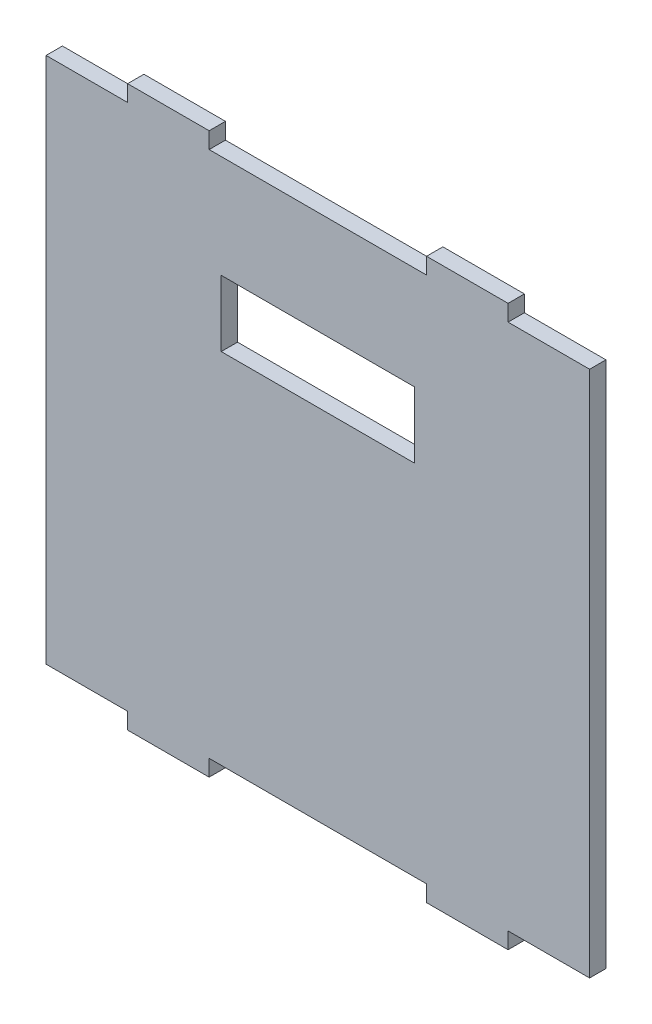
ISO-10303-21;
HEADER;
FILE_DESCRIPTION(('STEP AP214'),'2;1');
FILE_NAME('part.step','',(''),(''),'','','');
FILE_SCHEMA(('AUTOMOTIVE_DESIGN { 1 0 10303 214 1 1 1 1 }'));
ENDSEC;
DATA;
#1=APPLICATION_CONTEXT('core data for automotive mechanical design processes');
#2=APPLICATION_PROTOCOL_DEFINITION('international standard','automotive_design',2000,#1);
#3=PRODUCT_CONTEXT('',#1,'mechanical');
#4=PRODUCT('Part','Part','',(#3));
#5=PRODUCT_RELATED_PRODUCT_CATEGORY('part','',(#4));
#6=PRODUCT_DEFINITION_FORMATION('','',#4);
#7=PRODUCT_DEFINITION_CONTEXT('part definition',#1,'design');
#8=PRODUCT_DEFINITION('design','',#6,#7);
#9=PRODUCT_DEFINITION_SHAPE('','',#8);
#10=(LENGTH_UNIT() NAMED_UNIT(*) SI_UNIT(.MILLI.,.METRE.));
#11=(NAMED_UNIT(*) PLANE_ANGLE_UNIT() SI_UNIT($,.RADIAN.));
#12=(NAMED_UNIT(*) SI_UNIT($,.STERADIAN.) SOLID_ANGLE_UNIT());
#13=UNCERTAINTY_MEASURE_WITH_UNIT(LENGTH_MEASURE(1.E-05),#10,'distance_accuracy_value','');
#14=(GEOMETRIC_REPRESENTATION_CONTEXT(3) GLOBAL_UNCERTAINTY_ASSIGNED_CONTEXT((#13)) GLOBAL_UNIT_ASSIGNED_CONTEXT((#10,
#11,#12)) REPRESENTATION_CONTEXT('',''));
#15=CARTESIAN_POINT('',(0.,0.,0.));
#16=DIRECTION('',(0.,0.,1.));
#17=DIRECTION('',(1.,0.,0.));
#18=AXIS2_PLACEMENT_3D('',#15,#16,#17);
#19=CARTESIAN_POINT('',(70.,-97.,6.));
#20=DIRECTION('',(0.,1.,0.));
#21=DIRECTION('',(0.,0.,1.));
#22=AXIS2_PLACEMENT_3D('',#19,#20,#21);
#23=PLANE('',#22);
#24=DIRECTION('',(1.,0.,0.));
#25=VECTOR('',#24,1.);
#26=CARTESIAN_POINT('',(70.,-97.,0.));
#27=LINE('',#26,#25);
#28=CARTESIAN_POINT('',(70.,-97.,0.));
#29=VERTEX_POINT('',#28);
#30=CARTESIAN_POINT('',(100.,-97.,0.));
#31=VERTEX_POINT('',#30);
#32=EDGE_CURVE('E249',#29,#31,#27,.T.);
#33=ORIENTED_EDGE('',*,*,#32,.T.);
#34=DIRECTION('',(0.,0.,-1.));
#35=VECTOR('',#34,1.);
#36=CARTESIAN_POINT('',(100.,-97.,6.));
#37=LINE('',#36,#35);
#38=CARTESIAN_POINT('',(100.,-97.,6.));
#39=VERTEX_POINT('',#38);
#40=EDGE_CURVE('E11',#39,#31,#37,.T.);
#41=ORIENTED_EDGE('',*,*,#40,.F.);
#42=DIRECTION('',(1.,0.,0.));
#43=VECTOR('',#42,1.);
#44=CARTESIAN_POINT('',(70.,-97.,6.));
#45=LINE('',#44,#43);
#46=CARTESIAN_POINT('',(70.,-97.,6.));
#47=VERTEX_POINT('',#46);
#48=EDGE_CURVE('E255',#47,#39,#45,.T.);
#49=ORIENTED_EDGE('',*,*,#48,.F.);
#50=DIRECTION('',(0.,0.,-1.));
#51=VECTOR('',#50,1.);
#52=CARTESIAN_POINT('',(70.,-97.,6.));
#53=LINE('',#52,#51);
#54=EDGE_CURVE('E317',#47,#29,#53,.T.);
#55=ORIENTED_EDGE('',*,*,#54,.T.);
#56=EDGE_LOOP('',(#33,#41,#49,#55));
#57=FACE_BOUND('',#56,.T.);
#58=ADVANCED_FACE('F45',(#57),#23,.F.);
#59=CARTESIAN_POINT('',(100.,97.,6.));
#60=DIRECTION('',(-1.,0.,0.));
#61=DIRECTION('',(0.,-1.,0.));
#62=AXIS2_PLACEMENT_3D('',#59,#60,#61);
#63=PLANE('',#62);
#64=DIRECTION('',(0.,1.,0.));
#65=VECTOR('',#64,1.);
#66=CARTESIAN_POINT('',(100.,97.,0.));
#67=LINE('',#66,#65);
#68=CARTESIAN_POINT('',(100.,97.,0.));
#69=VERTEX_POINT('',#68);
#70=EDGE_CURVE('E321',#31,#69,#67,.T.);
#71=ORIENTED_EDGE('',*,*,#70,.T.);
#72=DIRECTION('',(0.,0.,-1.));
#73=VECTOR('',#72,1.);
#74=CARTESIAN_POINT('',(100.,97.,6.));
#75=LINE('',#74,#73);
#76=CARTESIAN_POINT('',(100.,97.,6.));
#77=VERTEX_POINT('',#76);
#78=EDGE_CURVE('E53',#77,#69,#75,.T.);
#79=ORIENTED_EDGE('',*,*,#78,.F.);
#80=DIRECTION('',(0.,1.,0.));
#81=VECTOR('',#80,1.);
#82=CARTESIAN_POINT('',(100.,97.,6.));
#83=LINE('',#82,#81);
#84=EDGE_CURVE('E259',#39,#77,#83,.T.);
#85=ORIENTED_EDGE('',*,*,#84,.F.);
#86=ORIENTED_EDGE('',*,*,#40,.T.);
#87=EDGE_LOOP('',(#71,#79,#85,#86));
#88=FACE_BOUND('',#87,.T.);
#89=ADVANCED_FACE('F474',(#88),#63,.F.);
#90=CARTESIAN_POINT('',(100.,97.,6.));
#91=DIRECTION('',(0.,-1.,0.));
#92=DIRECTION('',(0.,0.,-1.));
#93=AXIS2_PLACEMENT_3D('',#90,#91,#92);
#94=PLANE('',#93);
#95=DIRECTION('',(-1.,0.,0.));
#96=VECTOR('',#95,1.);
#97=CARTESIAN_POINT('',(100.,97.,0.));
#98=LINE('',#97,#96);
#99=CARTESIAN_POINT('',(70.,97.,0.));
#100=VERTEX_POINT('',#99);
#101=EDGE_CURVE('E324',#69,#100,#98,.T.);
#102=ORIENTED_EDGE('',*,*,#101,.T.);
#103=DIRECTION('',(0.,0.,-1.));
#104=VECTOR('',#103,1.);
#105=CARTESIAN_POINT('',(70.,97.,6.));
#106=LINE('',#105,#104);
#107=CARTESIAN_POINT('',(70.,97.,6.));
#108=VERTEX_POINT('',#107);
#109=EDGE_CURVE('E444',#108,#100,#106,.T.);
#110=ORIENTED_EDGE('',*,*,#109,.F.);
#111=DIRECTION('',(-1.,0.,0.));
#112=VECTOR('',#111,1.);
#113=CARTESIAN_POINT('',(100.,97.,6.));
#114=LINE('',#113,#112);
#115=EDGE_CURVE('E263',#77,#108,#114,.T.);
#116=ORIENTED_EDGE('',*,*,#115,.F.);
#117=ORIENTED_EDGE('',*,*,#78,.T.);
#118=EDGE_LOOP('',(#102,#110,#116,#117));
#119=FACE_BOUND('',#118,.T.);
#120=ADVANCED_FACE('F453',(#119),#94,.F.);
#121=CARTESIAN_POINT('',(70.,97.,6.));
#122=DIRECTION('',(-1.,0.,0.));
#123=DIRECTION('',(0.,0.,1.));
#124=AXIS2_PLACEMENT_3D('',#121,#122,#123);
#125=PLANE('',#124);
#126=DIRECTION('',(0.,1.,0.));
#127=VECTOR('',#126,1.);
#128=CARTESIAN_POINT('',(70.,97.,0.));
#129=LINE('',#128,#127);
#130=CARTESIAN_POINT('',(70.,103.,0.));
#131=VERTEX_POINT('',#130);
#132=EDGE_CURVE('E327',#100,#131,#129,.T.);
#133=ORIENTED_EDGE('',*,*,#132,.T.);
#134=DIRECTION('',(0.,0.,-1.));
#135=VECTOR('',#134,1.);
#136=CARTESIAN_POINT('',(70.,103.,6.));
#137=LINE('',#136,#135);
#138=CARTESIAN_POINT('',(70.,103.,6.));
#139=VERTEX_POINT('',#138);
#140=EDGE_CURVE('E440',#139,#131,#137,.T.);
#141=ORIENTED_EDGE('',*,*,#140,.F.);
#142=DIRECTION('',(0.,1.,0.));
#143=VECTOR('',#142,1.);
#144=CARTESIAN_POINT('',(70.,97.,6.));
#145=LINE('',#144,#143);
#146=EDGE_CURVE('E266',#108,#139,#145,.T.);
#147=ORIENTED_EDGE('',*,*,#146,.F.);
#148=ORIENTED_EDGE('',*,*,#109,.T.);
#149=EDGE_LOOP('',(#133,#141,#147,#148));
#150=FACE_BOUND('',#149,.T.);
#151=ADVANCED_FACE('F464',(#150),#125,.F.);
#152=CARTESIAN_POINT('',(70.,103.,6.));
#153=DIRECTION('',(0.,-1.,0.));
#154=DIRECTION('',(1.,0.,0.));
#155=AXIS2_PLACEMENT_3D('',#152,#153,#154);
#156=PLANE('',#155);
#157=DIRECTION('',(-1.,0.,0.));
#158=VECTOR('',#157,1.);
#159=CARTESIAN_POINT('',(70.,103.,0.));
#160=LINE('',#159,#158);
#161=CARTESIAN_POINT('',(40.,103.,0.));
#162=VERTEX_POINT('',#161);
#163=EDGE_CURVE('E330',#131,#162,#160,.T.);
#164=ORIENTED_EDGE('',*,*,#163,.T.);
#165=DIRECTION('',(0.,0.,-1.));
#166=VECTOR('',#165,1.);
#167=CARTESIAN_POINT('',(40.,103.,6.));
#168=LINE('',#167,#166);
#169=CARTESIAN_POINT('',(40.,103.,6.));
#170=VERTEX_POINT('',#169);
#171=EDGE_CURVE('E436',#170,#162,#168,.T.);
#172=ORIENTED_EDGE('',*,*,#171,.F.);
#173=DIRECTION('',(-1.,0.,0.));
#174=VECTOR('',#173,1.);
#175=CARTESIAN_POINT('',(70.,103.,6.));
#176=LINE('',#175,#174);
#177=EDGE_CURVE('E269',#139,#170,#176,.T.);
#178=ORIENTED_EDGE('',*,*,#177,.F.);
#179=ORIENTED_EDGE('',*,*,#140,.T.);
#180=EDGE_LOOP('',(#164,#172,#178,#179));
#181=FACE_BOUND('',#180,.T.);
#182=ADVANCED_FACE('F468',(#181),#156,.F.);
#183=CARTESIAN_POINT('',(40.,97.,6.));
#184=DIRECTION('',(1.,0.,0.));
#185=DIRECTION('',(0.,0.,-1.));
#186=AXIS2_PLACEMENT_3D('',#183,#184,#185);
#187=PLANE('',#186);
#188=DIRECTION('',(0.,-1.,0.));
#189=VECTOR('',#188,1.);
#190=CARTESIAN_POINT('',(40.,97.,0.));
#191=LINE('',#190,#189);
#192=CARTESIAN_POINT('',(40.,97.,0.));
#193=VERTEX_POINT('',#192);
#194=EDGE_CURVE('E333',#162,#193,#191,.T.);
#195=ORIENTED_EDGE('',*,*,#194,.T.);
#196=DIRECTION('',(0.,0.,-1.));
#197=VECTOR('',#196,1.);
#198=CARTESIAN_POINT('',(40.,97.,6.));
#199=LINE('',#198,#197);
#200=CARTESIAN_POINT('',(40.,97.,6.));
#201=VERTEX_POINT('',#200);
#202=EDGE_CURVE('E432',#201,#193,#199,.T.);
#203=ORIENTED_EDGE('',*,*,#202,.F.);
#204=DIRECTION('',(0.,-1.,0.));
#205=VECTOR('',#204,1.);
#206=CARTESIAN_POINT('',(40.,97.,6.));
#207=LINE('',#206,#205);
#208=EDGE_CURVE('E272',#170,#201,#207,.T.);
#209=ORIENTED_EDGE('',*,*,#208,.F.);
#210=ORIENTED_EDGE('',*,*,#171,.T.);
#211=EDGE_LOOP('',(#195,#203,#209,#210));
#212=FACE_BOUND('',#211,.T.);
#213=ADVANCED_FACE('F547',(#212),#187,.F.);
#214=CARTESIAN_POINT('',(40.,97.,6.));
#215=DIRECTION('',(0.,-1.,0.));
#216=DIRECTION('',(0.,0.,-1.));
#217=AXIS2_PLACEMENT_3D('',#214,#215,#216);
#218=PLANE('',#217);
#219=DIRECTION('',(-1.,0.,0.));
#220=VECTOR('',#219,1.);
#221=CARTESIAN_POINT('',(40.,97.,0.));
#222=LINE('',#221,#220);
#223=CARTESIAN_POINT('',(-40.,97.,0.));
#224=VERTEX_POINT('',#223);
#225=EDGE_CURVE('E336',#193,#224,#222,.T.);
#226=ORIENTED_EDGE('',*,*,#225,.T.);
#227=DIRECTION('',(0.,0.,-1.));
#228=VECTOR('',#227,1.);
#229=CARTESIAN_POINT('',(-40.,97.,6.));
#230=LINE('',#229,#228);
#231=CARTESIAN_POINT('',(-40.,97.,6.));
#232=VERTEX_POINT('',#231);
#233=EDGE_CURVE('E428',#232,#224,#230,.T.);
#234=ORIENTED_EDGE('',*,*,#233,.F.);
#235=DIRECTION('',(-1.,0.,0.));
#236=VECTOR('',#235,1.);
#237=CARTESIAN_POINT('',(40.,97.,6.));
#238=LINE('',#237,#236);
#239=EDGE_CURVE('E275',#201,#232,#238,.T.);
#240=ORIENTED_EDGE('',*,*,#239,.F.);
#241=ORIENTED_EDGE('',*,*,#202,.T.);
#242=EDGE_LOOP('',(#226,#234,#240,#241));
#243=FACE_BOUND('',#242,.T.);
#244=ADVANCED_FACE('F545',(#243),#218,.F.);
#245=CARTESIAN_POINT('',(-40.,97.,6.));
#246=DIRECTION('',(-1.,0.,0.));
#247=DIRECTION('',(0.,0.,1.));
#248=AXIS2_PLACEMENT_3D('',#245,#246,#247);
#249=PLANE('',#248);
#250=DIRECTION('',(0.,1.,0.));
#251=VECTOR('',#250,1.);
#252=CARTESIAN_POINT('',(-40.,97.,0.));
#253=LINE('',#252,#251);
#254=CARTESIAN_POINT('',(-40.,103.,0.));
#255=VERTEX_POINT('',#254);
#256=EDGE_CURVE('E339',#224,#255,#253,.T.);
#257=ORIENTED_EDGE('',*,*,#256,.T.);
#258=DIRECTION('',(0.,0.,-1.));
#259=VECTOR('',#258,1.);
#260=CARTESIAN_POINT('',(-40.,103.,6.));
#261=LINE('',#260,#259);
#262=CARTESIAN_POINT('',(-40.,103.,6.));
#263=VERTEX_POINT('',#262);
#264=EDGE_CURVE('E424',#263,#255,#261,.T.);
#265=ORIENTED_EDGE('',*,*,#264,.F.);
#266=DIRECTION('',(0.,1.,0.));
#267=VECTOR('',#266,1.);
#268=CARTESIAN_POINT('',(-40.,97.,6.));
#269=LINE('',#268,#267);
#270=EDGE_CURVE('E278',#232,#263,#269,.T.);
#271=ORIENTED_EDGE('',*,*,#270,.F.);
#272=ORIENTED_EDGE('',*,*,#233,.T.);
#273=EDGE_LOOP('',(#257,#265,#271,#272));
#274=FACE_BOUND('',#273,.T.);
#275=ADVANCED_FACE('F540',(#274),#249,.F.);
#276=CARTESIAN_POINT('',(-40.,103.,6.));
#277=DIRECTION('',(0.,-1.,0.));
#278=DIRECTION('',(1.,0.,0.));
#279=AXIS2_PLACEMENT_3D('',#276,#277,#278);
#280=PLANE('',#279);
#281=DIRECTION('',(-1.,0.,0.));
#282=VECTOR('',#281,1.);
#283=CARTESIAN_POINT('',(-40.,103.,0.));
#284=LINE('',#283,#282);
#285=CARTESIAN_POINT('',(-70.,103.,0.));
#286=VERTEX_POINT('',#285);
#287=EDGE_CURVE('E342',#255,#286,#284,.T.);
#288=ORIENTED_EDGE('',*,*,#287,.T.);
#289=DIRECTION('',(0.,0.,-1.));
#290=VECTOR('',#289,1.);
#291=CARTESIAN_POINT('',(-70.,103.,6.));
#292=LINE('',#291,#290);
#293=CARTESIAN_POINT('',(-70.,103.,6.));
#294=VERTEX_POINT('',#293);
#295=EDGE_CURVE('E420',#294,#286,#292,.T.);
#296=ORIENTED_EDGE('',*,*,#295,.F.);
#297=DIRECTION('',(-1.,0.,0.));
#298=VECTOR('',#297,1.);
#299=CARTESIAN_POINT('',(-40.,103.,6.));
#300=LINE('',#299,#298);
#301=EDGE_CURVE('E281',#263,#294,#300,.T.);
#302=ORIENTED_EDGE('',*,*,#301,.F.);
#303=ORIENTED_EDGE('',*,*,#264,.T.);
#304=EDGE_LOOP('',(#288,#296,#302,#303));
#305=FACE_BOUND('',#304,.T.);
#306=ADVANCED_FACE('F535',(#305),#280,.F.);
#307=CARTESIAN_POINT('',(-70.,97.,6.));
#308=DIRECTION('',(1.,0.,0.));
#309=DIRECTION('',(0.,0.,-1.));
#310=AXIS2_PLACEMENT_3D('',#307,#308,#309);
#311=PLANE('',#310);
#312=DIRECTION('',(0.,-1.,0.));
#313=VECTOR('',#312,1.);
#314=CARTESIAN_POINT('',(-70.,97.,0.));
#315=LINE('',#314,#313);
#316=CARTESIAN_POINT('',(-70.,97.,0.));
#317=VERTEX_POINT('',#316);
#318=EDGE_CURVE('E345',#286,#317,#315,.T.);
#319=ORIENTED_EDGE('',*,*,#318,.T.);
#320=DIRECTION('',(0.,0.,-1.));
#321=VECTOR('',#320,1.);
#322=CARTESIAN_POINT('',(-70.,97.,6.));
#323=LINE('',#322,#321);
#324=CARTESIAN_POINT('',(-70.,97.,6.));
#325=VERTEX_POINT('',#324);
#326=EDGE_CURVE('E416',#325,#317,#323,.T.);
#327=ORIENTED_EDGE('',*,*,#326,.F.);
#328=DIRECTION('',(0.,-1.,0.));
#329=VECTOR('',#328,1.);
#330=CARTESIAN_POINT('',(-70.,97.,6.));
#331=LINE('',#330,#329);
#332=EDGE_CURVE('E284',#294,#325,#331,.T.);
#333=ORIENTED_EDGE('',*,*,#332,.F.);
#334=ORIENTED_EDGE('',*,*,#295,.T.);
#335=EDGE_LOOP('',(#319,#327,#333,#334));
#336=FACE_BOUND('',#335,.T.);
#337=ADVANCED_FACE('F531',(#336),#311,.F.);
#338=CARTESIAN_POINT('',(-70.,97.,6.));
#339=DIRECTION('',(0.,-1.,0.));
#340=DIRECTION('',(0.,0.,-1.));
#341=AXIS2_PLACEMENT_3D('',#338,#339,#340);
#342=PLANE('',#341);
#343=DIRECTION('',(-1.,0.,0.));
#344=VECTOR('',#343,1.);
#345=CARTESIAN_POINT('',(-70.,97.,0.));
#346=LINE('',#345,#344);
#347=CARTESIAN_POINT('',(-100.,97.,0.));
#348=VERTEX_POINT('',#347);
#349=EDGE_CURVE('E348',#317,#348,#346,.T.);
#350=ORIENTED_EDGE('',*,*,#349,.T.);
#351=DIRECTION('',(0.,0.,-1.));
#352=VECTOR('',#351,1.);
#353=CARTESIAN_POINT('',(-100.,97.,6.));
#354=LINE('',#353,#352);
#355=CARTESIAN_POINT('',(-100.,97.,6.));
#356=VERTEX_POINT('',#355);
#357=EDGE_CURVE('E412',#356,#348,#354,.T.);
#358=ORIENTED_EDGE('',*,*,#357,.F.);
#359=DIRECTION('',(-1.,0.,0.));
#360=VECTOR('',#359,1.);
#361=CARTESIAN_POINT('',(-70.,97.,6.));
#362=LINE('',#361,#360);
#363=EDGE_CURVE('E287',#325,#356,#362,.T.);
#364=ORIENTED_EDGE('',*,*,#363,.F.);
#365=ORIENTED_EDGE('',*,*,#326,.T.);
#366=EDGE_LOOP('',(#350,#358,#364,#365));
#367=FACE_BOUND('',#366,.T.);
#368=ADVANCED_FACE('F526',(#367),#342,.F.);
#369=CARTESIAN_POINT('',(-100.,97.,6.));
#370=DIRECTION('',(1.,0.,0.));
#371=DIRECTION('',(0.,1.,0.));
#372=AXIS2_PLACEMENT_3D('',#369,#370,#371);
#373=PLANE('',#372);
#374=DIRECTION('',(0.,-1.,0.));
#375=VECTOR('',#374,1.);
#376=CARTESIAN_POINT('',(-100.,97.,0.));
#377=LINE('',#376,#375);
#378=CARTESIAN_POINT('',(-100.,-97.,0.));
#379=VERTEX_POINT('',#378);
#380=EDGE_CURVE('E351',#348,#379,#377,.T.);
#381=ORIENTED_EDGE('',*,*,#380,.T.);
#382=DIRECTION('',(0.,0.,-1.));
#383=VECTOR('',#382,1.);
#384=CARTESIAN_POINT('',(-100.,-97.,6.));
#385=LINE('',#384,#383);
#386=CARTESIAN_POINT('',(-100.,-97.,6.));
#387=VERTEX_POINT('',#386);
#388=EDGE_CURVE('E408',#387,#379,#385,.T.);
#389=ORIENTED_EDGE('',*,*,#388,.F.);
#390=DIRECTION('',(0.,-1.,0.));
#391=VECTOR('',#390,1.);
#392=CARTESIAN_POINT('',(-100.,97.,6.));
#393=LINE('',#392,#391);
#394=EDGE_CURVE('E290',#356,#387,#393,.T.);
#395=ORIENTED_EDGE('',*,*,#394,.F.);
#396=ORIENTED_EDGE('',*,*,#357,.T.);
#397=EDGE_LOOP('',(#381,#389,#395,#396));
#398=FACE_BOUND('',#397,.T.);
#399=ADVANCED_FACE('F520',(#398),#373,.F.);
#400=CARTESIAN_POINT('',(-70.,-97.,6.));
#401=DIRECTION('',(0.,1.,0.));
#402=DIRECTION('',(-1.,0.,0.));
#403=AXIS2_PLACEMENT_3D('',#400,#401,#402);
#404=PLANE('',#403);
#405=DIRECTION('',(1.,0.,0.));
#406=VECTOR('',#405,1.);
#407=CARTESIAN_POINT('',(-70.,-97.,0.));
#408=LINE('',#407,#406);
#409=CARTESIAN_POINT('',(-70.,-97.,0.));
#410=VERTEX_POINT('',#409);
#411=EDGE_CURVE('E354',#379,#410,#408,.T.);
#412=ORIENTED_EDGE('',*,*,#411,.T.);
#413=DIRECTION('',(0.,0.,-1.));
#414=VECTOR('',#413,1.);
#415=CARTESIAN_POINT('',(-70.,-97.,6.));
#416=LINE('',#415,#414);
#417=CARTESIAN_POINT('',(-70.,-97.,6.));
#418=VERTEX_POINT('',#417);
#419=EDGE_CURVE('E404',#418,#410,#416,.T.);
#420=ORIENTED_EDGE('',*,*,#419,.F.);
#421=DIRECTION('',(1.,0.,0.));
#422=VECTOR('',#421,1.);
#423=CARTESIAN_POINT('',(-70.,-97.,6.));
#424=LINE('',#423,#422);
#425=EDGE_CURVE('E293',#387,#418,#424,.T.);
#426=ORIENTED_EDGE('',*,*,#425,.F.);
#427=ORIENTED_EDGE('',*,*,#388,.T.);
#428=EDGE_LOOP('',(#412,#420,#426,#427));
#429=FACE_BOUND('',#428,.T.);
#430=ADVANCED_FACE('F516',(#429),#404,.F.);
#431=CARTESIAN_POINT('',(-70.,-97.,6.));
#432=DIRECTION('',(1.,0.,0.));
#433=DIRECTION('',(0.,0.,-1.));
#434=AXIS2_PLACEMENT_3D('',#431,#432,#433);
#435=PLANE('',#434);
#436=DIRECTION('',(0.,-1.,0.));
#437=VECTOR('',#436,1.);
#438=CARTESIAN_POINT('',(-70.,-97.,0.));
#439=LINE('',#438,#437);
#440=CARTESIAN_POINT('',(-70.,-103.,0.));
#441=VERTEX_POINT('',#440);
#442=EDGE_CURVE('E357',#410,#441,#439,.T.);
#443=ORIENTED_EDGE('',*,*,#442,.T.);
#444=DIRECTION('',(0.,0.,-1.));
#445=VECTOR('',#444,1.);
#446=CARTESIAN_POINT('',(-70.,-103.,6.));
#447=LINE('',#446,#445);
#448=CARTESIAN_POINT('',(-70.,-103.,6.));
#449=VERTEX_POINT('',#448);
#450=EDGE_CURVE('E400',#449,#441,#447,.T.);
#451=ORIENTED_EDGE('',*,*,#450,.F.);
#452=DIRECTION('',(0.,-1.,0.));
#453=VECTOR('',#452,1.);
#454=CARTESIAN_POINT('',(-70.,-97.,6.));
#455=LINE('',#454,#453);
#456=EDGE_CURVE('E296',#418,#449,#455,.T.);
#457=ORIENTED_EDGE('',*,*,#456,.F.);
#458=ORIENTED_EDGE('',*,*,#419,.T.);
#459=EDGE_LOOP('',(#443,#451,#457,#458));
#460=FACE_BOUND('',#459,.T.);
#461=ADVANCED_FACE('F511',(#460),#435,.F.);
#462=CARTESIAN_POINT('',(-70.,-103.,6.));
#463=DIRECTION('',(0.,1.,0.));
#464=DIRECTION('',(0.,0.,1.));
#465=AXIS2_PLACEMENT_3D('',#462,#463,#464);
#466=PLANE('',#465);
#467=DIRECTION('',(1.,0.,0.));
#468=VECTOR('',#467,1.);
#469=CARTESIAN_POINT('',(-70.,-103.,0.));
#470=LINE('',#469,#468);
#471=CARTESIAN_POINT('',(-40.,-103.,0.));
#472=VERTEX_POINT('',#471);
#473=EDGE_CURVE('E360',#441,#472,#470,.T.);
#474=ORIENTED_EDGE('',*,*,#473,.T.);
#475=DIRECTION('',(0.,0.,-1.));
#476=VECTOR('',#475,1.);
#477=CARTESIAN_POINT('',(-40.,-103.,6.));
#478=LINE('',#477,#476);
#479=CARTESIAN_POINT('',(-40.,-103.,6.));
#480=VERTEX_POINT('',#479);
#481=EDGE_CURVE('E396',#480,#472,#478,.T.);
#482=ORIENTED_EDGE('',*,*,#481,.F.);
#483=DIRECTION('',(1.,0.,0.));
#484=VECTOR('',#483,1.);
#485=CARTESIAN_POINT('',(-70.,-103.,6.));
#486=LINE('',#485,#484);
#487=EDGE_CURVE('E299',#449,#480,#486,.T.);
#488=ORIENTED_EDGE('',*,*,#487,.F.);
#489=ORIENTED_EDGE('',*,*,#450,.T.);
#490=EDGE_LOOP('',(#474,#482,#488,#489));
#491=FACE_BOUND('',#490,.T.);
#492=ADVANCED_FACE('F505',(#491),#466,.F.);
#493=CARTESIAN_POINT('',(-40.,-97.,6.));
#494=DIRECTION('',(-1.,0.,0.));
#495=DIRECTION('',(0.,-1.,0.));
#496=AXIS2_PLACEMENT_3D('',#493,#494,#495);
#497=PLANE('',#496);
#498=DIRECTION('',(0.,1.,0.));
#499=VECTOR('',#498,1.);
#500=CARTESIAN_POINT('',(-40.,-97.,0.));
#501=LINE('',#500,#499);
#502=CARTESIAN_POINT('',(-40.,-97.,0.));
#503=VERTEX_POINT('',#502);
#504=EDGE_CURVE('E363',#472,#503,#501,.T.);
#505=ORIENTED_EDGE('',*,*,#504,.T.);
#506=DIRECTION('',(0.,0.,-1.));
#507=VECTOR('',#506,1.);
#508=CARTESIAN_POINT('',(-40.,-97.,6.));
#509=LINE('',#508,#507);
#510=CARTESIAN_POINT('',(-40.,-97.,6.));
#511=VERTEX_POINT('',#510);
#512=EDGE_CURVE('E392',#511,#503,#509,.T.);
#513=ORIENTED_EDGE('',*,*,#512,.F.);
#514=DIRECTION('',(0.,1.,0.));
#515=VECTOR('',#514,1.);
#516=CARTESIAN_POINT('',(-40.,-97.,6.));
#517=LINE('',#516,#515);
#518=EDGE_CURVE('E302',#480,#511,#517,.T.);
#519=ORIENTED_EDGE('',*,*,#518,.F.);
#520=ORIENTED_EDGE('',*,*,#481,.T.);
#521=EDGE_LOOP('',(#505,#513,#519,#520));
#522=FACE_BOUND('',#521,.T.);
#523=ADVANCED_FACE('F501',(#522),#497,.F.);
#524=CARTESIAN_POINT('',(-40.,-97.,6.));
#525=DIRECTION('',(0.,1.,0.));
#526=DIRECTION('',(0.,0.,1.));
#527=AXIS2_PLACEMENT_3D('',#524,#525,#526);
#528=PLANE('',#527);
#529=DIRECTION('',(1.,0.,0.));
#530=VECTOR('',#529,1.);
#531=CARTESIAN_POINT('',(-40.,-97.,0.));
#532=LINE('',#531,#530);
#533=CARTESIAN_POINT('',(40.,-97.,0.));
#534=VERTEX_POINT('',#533);
#535=EDGE_CURVE('E366',#503,#534,#532,.T.);
#536=ORIENTED_EDGE('',*,*,#535,.T.);
#537=DIRECTION('',(0.,0.,-1.));
#538=VECTOR('',#537,1.);
#539=CARTESIAN_POINT('',(40.,-97.,6.));
#540=LINE('',#539,#538);
#541=CARTESIAN_POINT('',(40.,-97.,6.));
#542=VERTEX_POINT('',#541);
#543=EDGE_CURVE('E388',#542,#534,#540,.T.);
#544=ORIENTED_EDGE('',*,*,#543,.F.);
#545=DIRECTION('',(1.,0.,0.));
#546=VECTOR('',#545,1.);
#547=CARTESIAN_POINT('',(-40.,-97.,6.));
#548=LINE('',#547,#546);
#549=EDGE_CURVE('E305',#511,#542,#548,.T.);
#550=ORIENTED_EDGE('',*,*,#549,.F.);
#551=ORIENTED_EDGE('',*,*,#512,.T.);
#552=EDGE_LOOP('',(#536,#544,#550,#551));
#553=FACE_BOUND('',#552,.T.);
#554=ADVANCED_FACE('F496',(#553),#528,.F.);
#555=CARTESIAN_POINT('',(40.,-97.,6.));
#556=DIRECTION('',(1.,0.,0.));
#557=DIRECTION('',(0.,0.,-1.));
#558=AXIS2_PLACEMENT_3D('',#555,#556,#557);
#559=PLANE('',#558);
#560=DIRECTION('',(0.,-1.,0.));
#561=VECTOR('',#560,1.);
#562=CARTESIAN_POINT('',(40.,-97.,0.));
#563=LINE('',#562,#561);
#564=CARTESIAN_POINT('',(40.,-103.,0.));
#565=VERTEX_POINT('',#564);
#566=EDGE_CURVE('E369',#534,#565,#563,.T.);
#567=ORIENTED_EDGE('',*,*,#566,.T.);
#568=DIRECTION('',(0.,0.,-1.));
#569=VECTOR('',#568,1.);
#570=CARTESIAN_POINT('',(40.,-103.,6.));
#571=LINE('',#570,#569);
#572=CARTESIAN_POINT('',(40.,-103.,6.));
#573=VERTEX_POINT('',#572);
#574=EDGE_CURVE('E384',#573,#565,#571,.T.);
#575=ORIENTED_EDGE('',*,*,#574,.F.);
#576=DIRECTION('',(0.,-1.,0.));
#577=VECTOR('',#576,1.);
#578=CARTESIAN_POINT('',(40.,-97.,6.));
#579=LINE('',#578,#577);
#580=EDGE_CURVE('E308',#542,#573,#579,.T.);
#581=ORIENTED_EDGE('',*,*,#580,.F.);
#582=ORIENTED_EDGE('',*,*,#543,.T.);
#583=EDGE_LOOP('',(#567,#575,#581,#582));
#584=FACE_BOUND('',#583,.T.);
#585=ADVANCED_FACE('F490',(#584),#559,.F.);
#586=CARTESIAN_POINT('',(40.,-103.,6.));
#587=DIRECTION('',(0.,1.,0.));
#588=DIRECTION('',(-1.,0.,0.));
#589=AXIS2_PLACEMENT_3D('',#586,#587,#588);
#590=PLANE('',#589);
#591=DIRECTION('',(1.,0.,0.));
#592=VECTOR('',#591,1.);
#593=CARTESIAN_POINT('',(40.,-103.,0.));
#594=LINE('',#593,#592);
#595=CARTESIAN_POINT('',(70.,-103.,0.));
#596=VERTEX_POINT('',#595);
#597=EDGE_CURVE('E372',#565,#596,#594,.T.);
#598=ORIENTED_EDGE('',*,*,#597,.T.);
#599=DIRECTION('',(0.,0.,-1.));
#600=VECTOR('',#599,1.);
#601=CARTESIAN_POINT('',(70.,-103.,6.));
#602=LINE('',#601,#600);
#603=CARTESIAN_POINT('',(70.,-103.,6.));
#604=VERTEX_POINT('',#603);
#605=EDGE_CURVE('E380',#604,#596,#602,.T.);
#606=ORIENTED_EDGE('',*,*,#605,.F.);
#607=DIRECTION('',(1.,0.,0.));
#608=VECTOR('',#607,1.);
#609=CARTESIAN_POINT('',(40.,-103.,6.));
#610=LINE('',#609,#608);
#611=EDGE_CURVE('E311',#573,#604,#610,.T.);
#612=ORIENTED_EDGE('',*,*,#611,.F.);
#613=ORIENTED_EDGE('',*,*,#574,.T.);
#614=EDGE_LOOP('',(#598,#606,#612,#613));
#615=FACE_BOUND('',#614,.T.);
#616=ADVANCED_FACE('F486',(#615),#590,.F.);
#617=CARTESIAN_POINT('',(70.,-97.,6.));
#618=DIRECTION('',(-1.,0.,0.));
#619=DIRECTION('',(0.,0.,1.));
#620=AXIS2_PLACEMENT_3D('',#617,#618,#619);
#621=PLANE('',#620);
#622=DIRECTION('',(0.,1.,0.));
#623=VECTOR('',#622,1.);
#624=CARTESIAN_POINT('',(70.,-97.,0.));
#625=LINE('',#624,#623);
#626=EDGE_CURVE('E260',#596,#29,#625,.T.);
#627=ORIENTED_EDGE('',*,*,#626,.T.);
#628=ORIENTED_EDGE('',*,*,#54,.F.);
#629=DIRECTION('',(0.,1.,0.));
#630=VECTOR('',#629,1.);
#631=CARTESIAN_POINT('',(70.,-97.,6.));
#632=LINE('',#631,#630);
#633=EDGE_CURVE('E314',#604,#47,#632,.T.);
#634=ORIENTED_EDGE('',*,*,#633,.F.);
#635=ORIENTED_EDGE('',*,*,#605,.T.);
#636=EDGE_LOOP('',(#627,#628,#634,#635));
#637=FACE_BOUND('',#636,.T.);
#638=ADVANCED_FACE('F481',(#637),#621,.F.);
#639=CARTESIAN_POINT('',(0.,0.,6.));
#640=DIRECTION('',(0.,0.,-1.));
#641=DIRECTION('',(-1.,0.,0.));
#642=AXIS2_PLACEMENT_3D('',#639,#640,#641);
#643=PLANE('',#642);
#644=DIRECTION('',(-1.,0.,0.));
#645=VECTOR('',#644,1.);
#646=CARTESIAN_POINT('',(35.55,34.85,6.));
#647=LINE('',#646,#645);
#648=CARTESIAN_POINT('',(35.55,34.85,6.));
#649=VERTEX_POINT('',#648);
#650=CARTESIAN_POINT('',(-35.55,34.85,6.));
#651=VERTEX_POINT('',#650);
#652=EDGE_CURVE('E215',#649,#651,#647,.T.);
#653=ORIENTED_EDGE('',*,*,#652,.T.);
#654=DIRECTION('',(0.,1.,0.));
#655=VECTOR('',#654,1.);
#656=CARTESIAN_POINT('',(-35.55,59.15,6.));
#657=LINE('',#656,#655);
#658=CARTESIAN_POINT('',(-35.55,59.15,6.));
#659=VERTEX_POINT('',#658);
#660=EDGE_CURVE('E208',#651,#659,#657,.T.);
#661=ORIENTED_EDGE('',*,*,#660,.T.);
#662=DIRECTION('',(1.,0.,0.));
#663=VECTOR('',#662,1.);
#664=CARTESIAN_POINT('',(35.55,59.15,6.));
#665=LINE('',#664,#663);
#666=CARTESIAN_POINT('',(35.55,59.15,6.));
#667=VERTEX_POINT('',#666);
#668=EDGE_CURVE('E218',#659,#667,#665,.T.);
#669=ORIENTED_EDGE('',*,*,#668,.T.);
#670=DIRECTION('',(0.,-1.,0.));
#671=VECTOR('',#670,1.);
#672=CARTESIAN_POINT('',(35.55,59.15,6.));
#673=LINE('',#672,#671);
#674=EDGE_CURVE('E60',#667,#649,#673,.T.);
#675=ORIENTED_EDGE('',*,*,#674,.T.);
#676=EDGE_LOOP('',(#653,#661,#669,#675));
#677=FACE_BOUND('',#676,.T.);
#678=ORIENTED_EDGE('',*,*,#48,.T.);
#679=ORIENTED_EDGE('',*,*,#84,.T.);
#680=ORIENTED_EDGE('',*,*,#115,.T.);
#681=ORIENTED_EDGE('',*,*,#146,.T.);
#682=ORIENTED_EDGE('',*,*,#177,.T.);
#683=ORIENTED_EDGE('',*,*,#208,.T.);
#684=ORIENTED_EDGE('',*,*,#239,.T.);
#685=ORIENTED_EDGE('',*,*,#270,.T.);
#686=ORIENTED_EDGE('',*,*,#301,.T.);
#687=ORIENTED_EDGE('',*,*,#332,.T.);
#688=ORIENTED_EDGE('',*,*,#363,.T.);
#689=ORIENTED_EDGE('',*,*,#394,.T.);
#690=ORIENTED_EDGE('',*,*,#425,.T.);
#691=ORIENTED_EDGE('',*,*,#456,.T.);
#692=ORIENTED_EDGE('',*,*,#487,.T.);
#693=ORIENTED_EDGE('',*,*,#518,.T.);
#694=ORIENTED_EDGE('',*,*,#549,.T.);
#695=ORIENTED_EDGE('',*,*,#580,.T.);
#696=ORIENTED_EDGE('',*,*,#611,.T.);
#697=ORIENTED_EDGE('',*,*,#633,.T.);
#698=EDGE_LOOP('',(#678,#679,#680,#681,#682,#683,#684,#685,#686,#687,#688,#689,#690,#691,#692,
#693,#694,#695,#696,#697));
#699=FACE_BOUND('',#698,.T.);
#700=ADVANCED_FACE('F223',(#677,#699),#643,.F.);
#701=CARTESIAN_POINT('',(0.,0.,0.));
#702=DIRECTION('',(0.,0.,-1.));
#703=DIRECTION('',(-1.,0.,0.));
#704=AXIS2_PLACEMENT_3D('',#701,#702,#703);
#705=PLANE('',#704);
#706=DIRECTION('',(0.,1.,0.));
#707=VECTOR('',#706,1.);
#708=CARTESIAN_POINT('',(-35.55,59.15,0.));
#709=LINE('',#708,#707);
#710=CARTESIAN_POINT('',(-35.55,34.85,0.));
#711=VERTEX_POINT('',#710);
#712=CARTESIAN_POINT('',(-35.55,59.15,0.));
#713=VERTEX_POINT('',#712);
#714=EDGE_CURVE('E68',#711,#713,#709,.T.);
#715=ORIENTED_EDGE('',*,*,#714,.F.);
#716=DIRECTION('',(-1.,0.,0.));
#717=VECTOR('',#716,1.);
#718=CARTESIAN_POINT('',(35.55,34.85,0.));
#719=LINE('',#718,#717);
#720=CARTESIAN_POINT('',(35.55,34.85,0.));
#721=VERTEX_POINT('',#720);
#722=EDGE_CURVE('E227',#721,#711,#719,.T.);
#723=ORIENTED_EDGE('',*,*,#722,.F.);
#724=DIRECTION('',(0.,-1.,0.));
#725=VECTOR('',#724,1.);
#726=CARTESIAN_POINT('',(35.55,59.15,0.));
#727=LINE('',#726,#725);
#728=CARTESIAN_POINT('',(35.55,59.15,0.));
#729=VERTEX_POINT('',#728);
#730=EDGE_CURVE('E231',#729,#721,#727,.T.);
#731=ORIENTED_EDGE('',*,*,#730,.F.);
#732=DIRECTION('',(1.,0.,0.));
#733=VECTOR('',#732,1.);
#734=CARTESIAN_POINT('',(35.55,59.15,0.));
#735=LINE('',#734,#733);
#736=EDGE_CURVE('E240',#713,#729,#735,.T.);
#737=ORIENTED_EDGE('',*,*,#736,.F.);
#738=EDGE_LOOP('',(#715,#723,#731,#737));
#739=FACE_BOUND('',#738,.T.);
#740=ORIENTED_EDGE('',*,*,#32,.F.);
#741=ORIENTED_EDGE('',*,*,#626,.F.);
#742=ORIENTED_EDGE('',*,*,#597,.F.);
#743=ORIENTED_EDGE('',*,*,#566,.F.);
#744=ORIENTED_EDGE('',*,*,#535,.F.);
#745=ORIENTED_EDGE('',*,*,#504,.F.);
#746=ORIENTED_EDGE('',*,*,#473,.F.);
#747=ORIENTED_EDGE('',*,*,#442,.F.);
#748=ORIENTED_EDGE('',*,*,#411,.F.);
#749=ORIENTED_EDGE('',*,*,#380,.F.);
#750=ORIENTED_EDGE('',*,*,#349,.F.);
#751=ORIENTED_EDGE('',*,*,#318,.F.);
#752=ORIENTED_EDGE('',*,*,#287,.F.);
#753=ORIENTED_EDGE('',*,*,#256,.F.);
#754=ORIENTED_EDGE('',*,*,#225,.F.);
#755=ORIENTED_EDGE('',*,*,#194,.F.);
#756=ORIENTED_EDGE('',*,*,#163,.F.);
#757=ORIENTED_EDGE('',*,*,#132,.F.);
#758=ORIENTED_EDGE('',*,*,#101,.F.);
#759=ORIENTED_EDGE('',*,*,#70,.F.);
#760=EDGE_LOOP('',(#740,#741,#742,#743,#744,#745,#746,#747,#748,#749,#750,#751,#752,#753,#754,
#755,#756,#757,#758,#759));
#761=FACE_BOUND('',#760,.T.);
#762=ADVANCED_FACE('F459',(#739,#761),#705,.T.);
#763=CARTESIAN_POINT('',(-35.55,59.15,6.));
#764=DIRECTION('',(-1.,0.,0.));
#765=DIRECTION('',(0.,0.,1.));
#766=AXIS2_PLACEMENT_3D('',#763,#764,#765);
#767=PLANE('',#766);
#768=ORIENTED_EDGE('',*,*,#714,.T.);
#769=DIRECTION('',(0.,0.,-1.));
#770=VECTOR('',#769,1.);
#771=CARTESIAN_POINT('',(-35.55,59.15,6.));
#772=LINE('',#771,#770);
#773=EDGE_CURVE('E204',#659,#713,#772,.T.);
#774=ORIENTED_EDGE('',*,*,#773,.F.);
#775=ORIENTED_EDGE('',*,*,#660,.F.);
#776=DIRECTION('',(0.,0.,-1.));
#777=VECTOR('',#776,1.);
#778=CARTESIAN_POINT('',(-35.55,34.85,6.));
#779=LINE('',#778,#777);
#780=EDGE_CURVE('E246',#651,#711,#779,.T.);
#781=ORIENTED_EDGE('',*,*,#780,.T.);
#782=EDGE_LOOP('',(#768,#774,#775,#781));
#783=FACE_BOUND('',#782,.T.);
#784=ADVANCED_FACE('F206',(#783),#767,.F.);
#785=CARTESIAN_POINT('',(35.55,34.85,6.));
#786=DIRECTION('',(0.,-1.,0.));
#787=DIRECTION('',(0.,0.,-1.));
#788=AXIS2_PLACEMENT_3D('',#785,#786,#787);
#789=PLANE('',#788);
#790=ORIENTED_EDGE('',*,*,#722,.T.);
#791=ORIENTED_EDGE('',*,*,#780,.F.);
#792=ORIENTED_EDGE('',*,*,#652,.F.);
#793=DIRECTION('',(0.,0.,-1.));
#794=VECTOR('',#793,1.);
#795=CARTESIAN_POINT('',(35.55,34.85,6.));
#796=LINE('',#795,#794);
#797=EDGE_CURVE('E250',#649,#721,#796,.T.);
#798=ORIENTED_EDGE('',*,*,#797,.T.);
#799=EDGE_LOOP('',(#790,#791,#792,#798));
#800=FACE_BOUND('',#799,.T.);
#801=ADVANCED_FACE('F716',(#800),#789,.F.);
#802=CARTESIAN_POINT('',(35.55,59.15,6.));
#803=DIRECTION('',(1.,0.,0.));
#804=DIRECTION('',(0.,0.,-1.));
#805=AXIS2_PLACEMENT_3D('',#802,#803,#804);
#806=PLANE('',#805);
#807=ORIENTED_EDGE('',*,*,#730,.T.);
#808=ORIENTED_EDGE('',*,*,#797,.F.);
#809=ORIENTED_EDGE('',*,*,#674,.F.);
#810=DIRECTION('',(0.,0.,-1.));
#811=VECTOR('',#810,1.);
#812=CARTESIAN_POINT('',(35.55,59.15,6.));
#813=LINE('',#812,#811);
#814=EDGE_CURVE('E214',#667,#729,#813,.T.);
#815=ORIENTED_EDGE('',*,*,#814,.T.);
#816=EDGE_LOOP('',(#807,#808,#809,#815));
#817=FACE_BOUND('',#816,.T.);
#818=ADVANCED_FACE('F725',(#817),#806,.F.);
#819=CARTESIAN_POINT('',(35.55,59.15,6.));
#820=DIRECTION('',(0.,1.,0.));
#821=DIRECTION('',(0.,0.,1.));
#822=AXIS2_PLACEMENT_3D('',#819,#820,#821);
#823=PLANE('',#822);
#824=ORIENTED_EDGE('',*,*,#736,.T.);
#825=ORIENTED_EDGE('',*,*,#814,.F.);
#826=ORIENTED_EDGE('',*,*,#668,.F.);
#827=ORIENTED_EDGE('',*,*,#773,.T.);
#828=EDGE_LOOP('',(#824,#825,#826,#827));
#829=FACE_BOUND('',#828,.T.);
#830=ADVANCED_FACE('F219',(#829),#823,.F.);
#831=CLOSED_SHELL('',(#58,#89,#120,#151,#182,#213,#244,#275,#306,#337,#368,#399,#430,#461,#492,
#523,#554,#585,#616,#638,#700,#762,#784,#801,#818,#830));
#832=MANIFOLD_SOLID_BREP('B2',#831);
#833=ADVANCED_BREP_SHAPE_REPRESENTATION('',(#18,#832),#14);
#834=SHAPE_DEFINITION_REPRESENTATION(#9,#833);
ENDSEC;
END-ISO-10303-21;
